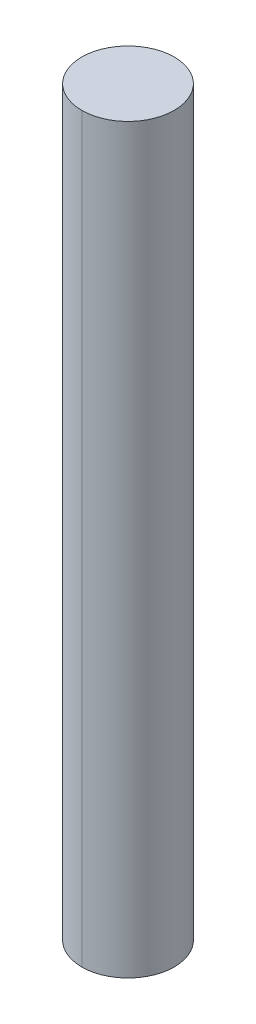
ISO-10303-21;
HEADER;
FILE_DESCRIPTION(('STEP AP214'),'2;1');
FILE_NAME('part.step','',(''),(''),'','','');
FILE_SCHEMA(('AUTOMOTIVE_DESIGN { 1 0 10303 214 1 1 1 1 }'));
ENDSEC;
DATA;
#1=APPLICATION_CONTEXT('core data for automotive mechanical design processes');
#2=APPLICATION_PROTOCOL_DEFINITION('international standard','automotive_design',2000,#1);
#3=PRODUCT_CONTEXT('',#1,'mechanical');
#4=PRODUCT('Part','Part','',(#3));
#5=PRODUCT_RELATED_PRODUCT_CATEGORY('part','',(#4));
#6=PRODUCT_DEFINITION_FORMATION('','',#4);
#7=PRODUCT_DEFINITION_CONTEXT('part definition',#1,'design');
#8=PRODUCT_DEFINITION('design','',#6,#7);
#9=PRODUCT_DEFINITION_SHAPE('','',#8);
#10=(LENGTH_UNIT() NAMED_UNIT(*) SI_UNIT(.MILLI.,.METRE.));
#11=(NAMED_UNIT(*) PLANE_ANGLE_UNIT() SI_UNIT($,.RADIAN.));
#12=(NAMED_UNIT(*) SI_UNIT($,.STERADIAN.) SOLID_ANGLE_UNIT());
#13=UNCERTAINTY_MEASURE_WITH_UNIT(LENGTH_MEASURE(1.E-05),#10,'distance_accuracy_value','');
#14=(GEOMETRIC_REPRESENTATION_CONTEXT(3) GLOBAL_UNCERTAINTY_ASSIGNED_CONTEXT((#13)) GLOBAL_UNIT_ASSIGNED_CONTEXT((#10,
#11,#12)) REPRESENTATION_CONTEXT('',''));
#15=CARTESIAN_POINT('',(0.,0.,0.));
#16=DIRECTION('',(0.,0.,1.));
#17=DIRECTION('',(1.,0.,0.));
#18=AXIS2_PLACEMENT_3D('',#15,#16,#17);
#19=CARTESIAN_POINT('',(0.,25.47,0.));
#20=DIRECTION('',(0.,-1.,0.));
#21=DIRECTION('',(0.,0.,-1.));
#22=AXIS2_PLACEMENT_3D('',#19,#20,#21);
#23=CYLINDRICAL_SURFACE('',#22,1.5875);
#24=CARTESIAN_POINT('',(0.,25.47,0.));
#25=DIRECTION('',(0.,1.,0.));
#26=DIRECTION('',(0.,0.,1.));
#27=AXIS2_PLACEMENT_3D('',#24,#25,#26);
#28=CIRCLE('',#27,1.5875);
#29=CARTESIAN_POINT('',(0.,25.47,1.5875));
#30=VERTEX_POINT('',#29);
#31=CARTESIAN_POINT('',(0.,25.47,-1.5875));
#32=VERTEX_POINT('',#31);
#33=EDGE_CURVE('E39',#30,#32,#28,.T.);
#34=ORIENTED_EDGE('',*,*,#33,.F.);
#35=DIRECTION('',(0.,-1.,0.));
#36=VECTOR('',#35,1.);
#37=CARTESIAN_POINT('',(0.,25.47,1.5875));
#38=LINE('',#37,#36);
#39=CARTESIAN_POINT('',(0.,0.,1.5875));
#40=VERTEX_POINT('',#39);
#41=EDGE_CURVE('E11',#30,#40,#38,.T.);
#42=ORIENTED_EDGE('',*,*,#41,.T.);
#43=CARTESIAN_POINT('',(0.,0.,0.));
#44=DIRECTION('',(0.,1.,0.));
#45=DIRECTION('',(0.,0.,1.));
#46=AXIS2_PLACEMENT_3D('',#43,#44,#45);
#47=CIRCLE('',#46,1.5875);
#48=CARTESIAN_POINT('',(0.,0.,-1.5875));
#49=VERTEX_POINT('',#48);
#50=EDGE_CURVE('E26',#40,#49,#47,.T.);
#51=ORIENTED_EDGE('',*,*,#50,.T.);
#52=DIRECTION('',(0.,-1.,0.));
#53=VECTOR('',#52,1.);
#54=CARTESIAN_POINT('',(0.,25.47,-1.5875));
#55=LINE('',#54,#53);
#56=EDGE_CURVE('E64',#32,#49,#55,.T.);
#57=ORIENTED_EDGE('',*,*,#56,.F.);
#58=EDGE_LOOP('',(#34,#42,#51,#57));
#59=FACE_BOUND('',#58,.T.);
#60=ADVANCED_FACE('F16',(#59),#23,.T.);
#61=CARTESIAN_POINT('',(0.,25.47,0.));
#62=DIRECTION('',(0.,-1.,0.));
#63=DIRECTION('',(0.,0.,-1.));
#64=AXIS2_PLACEMENT_3D('',#61,#62,#63);
#65=CYLINDRICAL_SURFACE('',#64,1.5875);
#66=ORIENTED_EDGE('',*,*,#41,.F.);
#67=CARTESIAN_POINT('',(0.,25.47,0.));
#68=DIRECTION('',(0.,1.,0.));
#69=DIRECTION('',(0.,0.,1.));
#70=AXIS2_PLACEMENT_3D('',#67,#68,#69);
#71=CIRCLE('',#70,1.5875);
#72=EDGE_CURVE('E61',#32,#30,#71,.T.);
#73=ORIENTED_EDGE('',*,*,#72,.F.);
#74=ORIENTED_EDGE('',*,*,#56,.T.);
#75=CARTESIAN_POINT('',(0.,0.,0.));
#76=DIRECTION('',(0.,1.,0.));
#77=DIRECTION('',(0.,0.,1.));
#78=AXIS2_PLACEMENT_3D('',#75,#76,#77);
#79=CIRCLE('',#78,1.5875);
#80=EDGE_CURVE('E20',#49,#40,#79,.T.);
#81=ORIENTED_EDGE('',*,*,#80,.T.);
#82=EDGE_LOOP('',(#66,#73,#74,#81));
#83=FACE_BOUND('',#82,.T.);
#84=ADVANCED_FACE('F18',(#83),#65,.T.);
#85=CARTESIAN_POINT('',(0.,25.47,0.));
#86=DIRECTION('',(0.,1.,0.));
#87=DIRECTION('',(1.,0.,0.));
#88=AXIS2_PLACEMENT_3D('',#85,#86,#87);
#89=PLANE('',#88);
#90=ORIENTED_EDGE('',*,*,#72,.T.);
#91=ORIENTED_EDGE('',*,*,#33,.T.);
#92=EDGE_LOOP('',(#90,#91));
#93=FACE_BOUND('',#92,.T.);
#94=ADVANCED_FACE('F59',(#93),#89,.T.);
#95=CARTESIAN_POINT('',(0.,0.,0.));
#96=DIRECTION('',(0.,1.,0.));
#97=DIRECTION('',(1.,0.,0.));
#98=AXIS2_PLACEMENT_3D('',#95,#96,#97);
#99=PLANE('',#98);
#100=ORIENTED_EDGE('',*,*,#80,.F.);
#101=ORIENTED_EDGE('',*,*,#50,.F.);
#102=EDGE_LOOP('',(#100,#101));
#103=FACE_BOUND('',#102,.T.);
#104=ADVANCED_FACE('F90',(#103),#99,.F.);
#105=CLOSED_SHELL('',(#60,#84,#94,#104));
#106=MANIFOLD_SOLID_BREP('B1',#105);
#107=ADVANCED_BREP_SHAPE_REPRESENTATION('',(#18,#106),#14);
#108=SHAPE_DEFINITION_REPRESENTATION(#9,#107);
ENDSEC;
END-ISO-10303-21;
